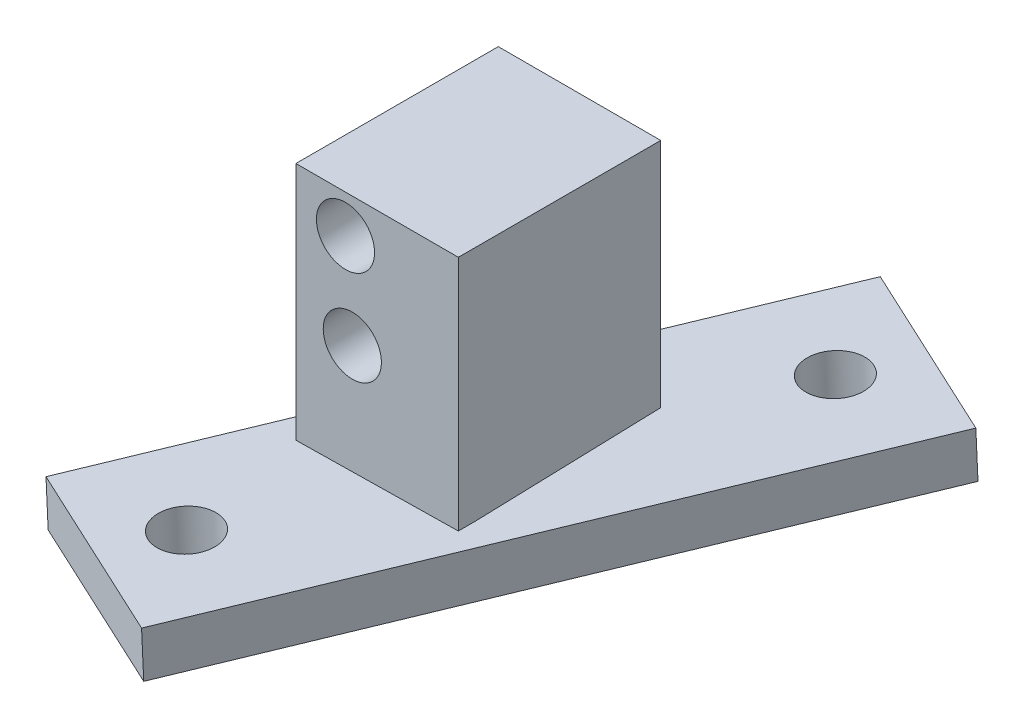
ISO-10303-21;
HEADER;
FILE_DESCRIPTION(('STEP AP214'),'2;1');
FILE_NAME('part.step','',(''),(''),'','','');
FILE_SCHEMA(('AUTOMOTIVE_DESIGN { 1 0 10303 214 1 1 1 1 }'));
ENDSEC;
DATA;
#1=APPLICATION_CONTEXT('core data for automotive mechanical design processes');
#2=APPLICATION_PROTOCOL_DEFINITION('international standard','automotive_design',2000,#1);
#3=PRODUCT_CONTEXT('',#1,'mechanical');
#4=PRODUCT('Part','Part','',(#3));
#5=PRODUCT_RELATED_PRODUCT_CATEGORY('part','',(#4));
#6=PRODUCT_DEFINITION_FORMATION('','',#4);
#7=PRODUCT_DEFINITION_CONTEXT('part definition',#1,'design');
#8=PRODUCT_DEFINITION('design','',#6,#7);
#9=PRODUCT_DEFINITION_SHAPE('','',#8);
#10=(LENGTH_UNIT() NAMED_UNIT(*) SI_UNIT(.MILLI.,.METRE.));
#11=(NAMED_UNIT(*) PLANE_ANGLE_UNIT() SI_UNIT($,.RADIAN.));
#12=(NAMED_UNIT(*) SI_UNIT($,.STERADIAN.) SOLID_ANGLE_UNIT());
#13=UNCERTAINTY_MEASURE_WITH_UNIT(LENGTH_MEASURE(1.E-05),#10,'distance_accuracy_value','');
#14=(GEOMETRIC_REPRESENTATION_CONTEXT(3) GLOBAL_UNCERTAINTY_ASSIGNED_CONTEXT((#13)) GLOBAL_UNIT_ASSIGNED_CONTEXT((#10,
#11,#12)) REPRESENTATION_CONTEXT('',''));
#15=CARTESIAN_POINT('',(0.,0.,0.));
#16=DIRECTION('',(0.,0.,1.));
#17=DIRECTION('',(1.,0.,0.));
#18=AXIS2_PLACEMENT_3D('',#15,#16,#17);
#19=CARTESIAN_POINT('',(-174.049593375286,0.,53.2479277886373));
#20=DIRECTION('',(1.,0.,0.));
#21=DIRECTION('',(0.,0.,-1.));
#22=AXIS2_PLACEMENT_3D('',#19,#20,#21);
#23=PLANE('',#22);
#24=DIRECTION('',(0.,1.,0.));
#25=VECTOR('',#24,1.);
#26=CARTESIAN_POINT('',(-174.049593375286,0.,22.0980000000002));
#27=LINE('',#26,#25);
#28=CARTESIAN_POINT('',(-174.049593375286,211.933065834821,22.0980000000002));
#29=VERTEX_POINT('',#28);
#30=CARTESIAN_POINT('',(-174.049593375286,237.82004779774,22.0980000000002));
#31=VERTEX_POINT('',#30);
#32=EDGE_CURVE('E140',#29,#31,#27,.T.);
#33=ORIENTED_EDGE('',*,*,#32,.F.);
#34=DIRECTION('',(0.,0.,1.));
#35=VECTOR('',#34,1.);
#36=CARTESIAN_POINT('',(-174.049593375286,211.933065834821,-17.7469464326559));
#37=LINE('',#36,#35);
#38=CARTESIAN_POINT('',(-174.049593375286,211.933065834821,20.2800597181621));
#39=VERTEX_POINT('',#38);
#40=EDGE_CURVE('E154',#39,#29,#37,.T.);
#41=ORIENTED_EDGE('',*,*,#40,.F.);
#42=DIRECTION('',(0.,0.03039944749549,-0.999537829995428));
#43=VECTOR('',#42,1.);
#44=CARTESIAN_POINT('',(-174.049593375286,210.735471106579,59.6571318198355));
#45=LINE('',#44,#43);
#46=CARTESIAN_POINT('',(-174.049593375286,212.54985350619,0.));
#47=VERTEX_POINT('',#46);
#48=EDGE_CURVE('E222',#39,#47,#45,.T.);
#49=ORIENTED_EDGE('',*,*,#48,.T.);
#50=DIRECTION('',(0.,-1.,0.));
#51=VECTOR('',#50,1.);
#52=CARTESIAN_POINT('',(-174.049593375286,0.,0.));
#53=LINE('',#52,#51);
#54=CARTESIAN_POINT('',(-174.049593375286,237.82004779774,0.));
#55=VERTEX_POINT('',#54);
#56=EDGE_CURVE('E239',#55,#47,#53,.T.);
#57=ORIENTED_EDGE('',*,*,#56,.F.);
#58=DIRECTION('',(0.,0.,-1.));
#59=VECTOR('',#58,1.);
#60=CARTESIAN_POINT('',(-174.049593375286,237.82004779774,53.2479277886373));
#61=LINE('',#60,#59);
#62=EDGE_CURVE('E255',#31,#55,#61,.T.);
#63=ORIENTED_EDGE('',*,*,#62,.F.);
#64=EDGE_LOOP('',(#33,#41,#49,#57,#63));
#65=FACE_BOUND('',#64,.T.);
#66=ADVANCED_FACE('F47',(#65),#23,.T.);
#67=CARTESIAN_POINT('',(-191.787654937191,0.,53.2479277886373));
#68=DIRECTION('',(-1.,0.,0.));
#69=DIRECTION('',(0.,0.,1.));
#70=AXIS2_PLACEMENT_3D('',#67,#68,#69);
#71=PLANE('',#70);
#72=DIRECTION('',(0.,-1.,0.));
#73=VECTOR('',#72,1.);
#74=CARTESIAN_POINT('',(-191.787654937191,0.,22.0980000000002));
#75=LINE('',#74,#73);
#76=CARTESIAN_POINT('',(-191.787654937191,237.82004779774,22.0980000000002));
#77=VERTEX_POINT('',#76);
#78=CARTESIAN_POINT('',(-191.787654937191,211.652316965885,22.0980000000002));
#79=VERTEX_POINT('',#78);
#80=EDGE_CURVE('E132',#77,#79,#75,.T.);
#81=ORIENTED_EDGE('',*,*,#80,.F.);
#82=DIRECTION('',(0.,0.,-1.));
#83=VECTOR('',#82,1.);
#84=CARTESIAN_POINT('',(-191.787654937191,237.82004779774,53.2479277886373));
#85=LINE('',#84,#83);
#86=CARTESIAN_POINT('',(-191.787654937191,237.82004779774,0.));
#87=VERTEX_POINT('',#86);
#88=EDGE_CURVE('E234',#77,#87,#85,.T.);
#89=ORIENTED_EDGE('',*,*,#88,.T.);
#90=DIRECTION('',(0.,1.,0.));
#91=VECTOR('',#90,1.);
#92=CARTESIAN_POINT('',(-191.787654937191,0.,0.));
#93=LINE('',#92,#91);
#94=CARTESIAN_POINT('',(-191.787654937191,211.652316965885,0.));
#95=VERTEX_POINT('',#94);
#96=EDGE_CURVE('E240',#95,#87,#93,.T.);
#97=ORIENTED_EDGE('',*,*,#96,.F.);
#98=DIRECTION('',(0.,0.,1.));
#99=VECTOR('',#98,1.);
#100=CARTESIAN_POINT('',(-191.787654937191,211.652316965885,-17.7469464326559));
#101=LINE('',#100,#99);
#102=CARTESIAN_POINT('',(-191.787654937191,211.652316965885,15.0624183971901));
#103=VERTEX_POINT('',#102);
#104=EDGE_CURVE('E149',#95,#103,#101,.T.);
#105=ORIENTED_EDGE('',*,*,#104,.T.);
#106=DIRECTION('',(0.,0.999994210647786,-0.00340274461436711));
#107=VECTOR('',#106,1.);
#108=CARTESIAN_POINT('',(-191.787654937191,205.771765025982,15.0824285294788));
#109=LINE('',#108,#107);
#110=CARTESIAN_POINT('',(-191.787654937191,211.811868321559,15.0618754815307));
#111=VERTEX_POINT('',#110);
#112=EDGE_CURVE('E63',#103,#111,#109,.T.);
#113=ORIENTED_EDGE('',*,*,#112,.T.);
#114=DIRECTION('',(0.,0.03039944749549,-0.999537829995428));
#115=VECTOR('',#114,1.);
#116=CARTESIAN_POINT('',(-191.787654937191,212.073788458369,6.44990695093485));
#117=LINE('',#116,#115);
#118=CARTESIAN_POINT('',(-191.787654937191,211.652316965885,20.3079450308957));
#119=VERTEX_POINT('',#118);
#120=EDGE_CURVE('E56',#119,#111,#117,.T.);
#121=ORIENTED_EDGE('',*,*,#120,.F.);
#122=EDGE_CURVE('E144',#119,#79,#101,.T.);
#123=ORIENTED_EDGE('',*,*,#122,.T.);
#124=EDGE_LOOP('',(#81,#89,#97,#105,#113,#121,#123));
#125=FACE_BOUND('',#124,.T.);
#126=ADVANCED_FACE('F145',(#125),#71,.T.);
#127=CARTESIAN_POINT('',(-185.628460018152,223.67720196977,53.2479277886373));
#128=DIRECTION('',(0.,0.,-1.));
#129=DIRECTION('',(-1.,0.,0.));
#130=AXIS2_PLACEMENT_3D('',#127,#128,#129);
#131=CYLINDRICAL_SURFACE('',#130,3.17499999999997);
#132=CARTESIAN_POINT('',(-185.628460018152,223.67720196977,22.0980000000002));
#133=DIRECTION('',(0.,0.,-1.));
#134=DIRECTION('',(-1.,0.,0.));
#135=AXIS2_PLACEMENT_3D('',#132,#133,#134);
#136=CIRCLE('',#135,3.17499999999997);
#137=CARTESIAN_POINT('',(-188.803460018152,223.67720196977,22.0980000000002));
#138=VERTEX_POINT('',#137);
#139=EDGE_CURVE('E243',#138,#138,#136,.T.);
#140=ORIENTED_EDGE('',*,*,#139,.F.);
#141=EDGE_LOOP('',(#140));
#142=FACE_BOUND('',#141,.T.);
#143=CARTESIAN_POINT('',(-185.628460018152,223.67720196977,0.));
#144=DIRECTION('',(0.,0.,1.));
#145=DIRECTION('',(1.,0.,0.));
#146=AXIS2_PLACEMENT_3D('',#143,#144,#145);
#147=CIRCLE('',#146,3.17499999999997);
#148=CARTESIAN_POINT('',(-182.453460018152,223.67720196977,0.));
#149=VERTEX_POINT('',#148);
#150=EDGE_CURVE('E247',#149,#149,#147,.T.);
#151=ORIENTED_EDGE('',*,*,#150,.F.);
#152=EDGE_LOOP('',(#151));
#153=FACE_BOUND('',#152,.T.);
#154=ADVANCED_FACE('F328',(#142,#153),#131,.F.);
#155=CARTESIAN_POINT('',(-186.372442080017,233.67720196977,53.2479277886373));
#156=DIRECTION('',(0.,0.,-1.));
#157=DIRECTION('',(-1.,0.,0.));
#158=AXIS2_PLACEMENT_3D('',#155,#156,#157);
#159=CYLINDRICAL_SURFACE('',#158,3.17500000000009);
#160=CARTESIAN_POINT('',(-186.372442080017,233.67720196977,22.0980000000002));
#161=DIRECTION('',(0.,0.,-1.));
#162=DIRECTION('',(-1.,0.,0.));
#163=AXIS2_PLACEMENT_3D('',#160,#161,#162);
#164=CIRCLE('',#163,3.17500000000009);
#165=CARTESIAN_POINT('',(-189.547442080018,233.67720196977,22.0980000000002));
#166=VERTEX_POINT('',#165);
#167=EDGE_CURVE('E141',#166,#166,#164,.T.);
#168=ORIENTED_EDGE('',*,*,#167,.F.);
#169=EDGE_LOOP('',(#168));
#170=FACE_BOUND('',#169,.T.);
#171=CARTESIAN_POINT('',(-186.372442080017,233.67720196977,0.));
#172=DIRECTION('',(0.,0.,1.));
#173=DIRECTION('',(1.,0.,0.));
#174=AXIS2_PLACEMENT_3D('',#171,#172,#173);
#175=CIRCLE('',#174,3.17500000000009);
#176=CARTESIAN_POINT('',(-183.197442080017,233.67720196977,0.));
#177=VERTEX_POINT('',#176);
#178=EDGE_CURVE('E251',#177,#177,#175,.T.);
#179=ORIENTED_EDGE('',*,*,#178,.F.);
#180=EDGE_LOOP('',(#179));
#181=FACE_BOUND('',#180,.T.);
#182=ADVANCED_FACE('F332',(#170,#181),#159,.F.);
#183=CARTESIAN_POINT('',(0.,237.82004779774,53.2479277886373));
#184=DIRECTION('',(0.,1.,0.));
#185=DIRECTION('',(0.,0.,1.));
#186=AXIS2_PLACEMENT_3D('',#183,#184,#185);
#187=PLANE('',#186);
#188=DIRECTION('',(-1.,0.,0.));
#189=VECTOR('',#188,1.);
#190=CARTESIAN_POINT('',(0.,237.82004779774,22.0980000000002));
#191=LINE('',#190,#189);
#192=EDGE_CURVE('E137',#31,#77,#191,.T.);
#193=ORIENTED_EDGE('',*,*,#192,.F.);
#194=ORIENTED_EDGE('',*,*,#62,.T.);
#195=DIRECTION('',(1.,0.,0.));
#196=VECTOR('',#195,1.);
#197=CARTESIAN_POINT('',(0.,237.82004779774,0.));
#198=LINE('',#197,#196);
#199=EDGE_CURVE('E235',#87,#55,#198,.T.);
#200=ORIENTED_EDGE('',*,*,#199,.F.);
#201=ORIENTED_EDGE('',*,*,#88,.F.);
#202=EDGE_LOOP('',(#193,#194,#200,#201));
#203=FACE_BOUND('',#202,.T.);
#204=ADVANCED_FACE('F293',(#203),#187,.T.);
#205=CARTESIAN_POINT('',(0.,0.,0.));
#206=DIRECTION('',(0.,0.,1.));
#207=DIRECTION('',(1.,0.,0.));
#208=AXIS2_PLACEMENT_3D('',#205,#206,#207);
#209=PLANE('',#208);
#210=ORIENTED_EDGE('',*,*,#178,.T.);
#211=EDGE_LOOP('',(#210));
#212=FACE_BOUND('',#211,.T.);
#213=ORIENTED_EDGE('',*,*,#150,.T.);
#214=EDGE_LOOP('',(#213));
#215=FACE_BOUND('',#214,.T.);
#216=DIRECTION('',(0.999875524233858,0.0157777069965274,0.));
#217=VECTOR('',#216,1.);
#218=CARTESIAN_POINT('',(-3.39645909135796,215.24270385157,0.));
#219=LINE('',#218,#217);
#220=CARTESIAN_POINT('',(-184.760241635504,212.380842998485,0.));
#221=VERTEX_POINT('',#220);
#222=EDGE_CURVE('E71',#221,#47,#219,.T.);
#223=ORIENTED_EDGE('',*,*,#222,.F.);
#224=DIRECTION('',(0.00158782850533025,-0.999998739399524,0.));
#225=VECTOR('',#224,1.);
#226=CARTESIAN_POINT('',(-184.422551886707,-0.292831754055308,0.));
#227=LINE('',#226,#225);
#228=CARTESIAN_POINT('',(-184.759261492733,211.763558744085,0.));
#229=VERTEX_POINT('',#228);
#230=EDGE_CURVE('E272',#221,#229,#227,.T.);
#231=ORIENTED_EDGE('',*,*,#230,.T.);
#232=DIRECTION('',(-0.999874768918115,-0.0158255009698612,0.));
#233=VECTOR('',#232,1.);
#234=CARTESIAN_POINT('',(-191.787654937191,211.652316965885,0.));
#235=LINE('',#234,#233);
#236=EDGE_CURVE('E159',#229,#95,#235,.T.);
#237=ORIENTED_EDGE('',*,*,#236,.T.);
#238=ORIENTED_EDGE('',*,*,#96,.T.);
#239=ORIENTED_EDGE('',*,*,#199,.T.);
#240=ORIENTED_EDGE('',*,*,#56,.T.);
#241=EDGE_LOOP('',(#223,#231,#237,#238,#239,#240));
#242=FACE_BOUND('',#241,.T.);
#243=ADVANCED_FACE('F288',(#212,#215,#242),#209,.F.);
#244=CARTESIAN_POINT('',(-218.418058808739,235.670935246382,22.0980000000002));
#245=DIRECTION('',(0.,0.,-1.));
#246=DIRECTION('',(0.999875524233858,0.0157777069965279,0.));
#247=AXIS2_PLACEMENT_3D('',#244,#245,#246);
#248=PLANE('',#247);
#249=ORIENTED_EDGE('',*,*,#139,.T.);
#250=EDGE_LOOP('',(#249));
#251=FACE_BOUND('',#250,.T.);
#252=ORIENTED_EDGE('',*,*,#167,.T.);
#253=EDGE_LOOP('',(#252));
#254=FACE_BOUND('',#253,.T.);
#255=ORIENTED_EDGE('',*,*,#80,.T.);
#256=DIRECTION('',(0.999874768918114,0.0158255009698612,0.));
#257=VECTOR('',#256,1.);
#258=CARTESIAN_POINT('',(-191.787654937191,211.652316965885,22.0980000000002));
#259=LINE('',#258,#257);
#260=EDGE_CURVE('E135',#79,#29,#259,.T.);
#261=ORIENTED_EDGE('',*,*,#260,.T.);
#262=ORIENTED_EDGE('',*,*,#32,.T.);
#263=ORIENTED_EDGE('',*,*,#192,.T.);
#264=EDGE_LOOP('',(#255,#261,#262,#263));
#265=FACE_BOUND('',#264,.T.);
#266=ADVANCED_FACE('F49',(#251,#254,#265),#248,.F.);
#267=CARTESIAN_POINT('',(-183.061641055121,205.881868051363,47.4393640134294));
#268=DIRECTION('',(-0.42256570461406,-0.0342130418321604,0.905686310514084));
#269=DIRECTION('',(0.906216843823298,0.,0.42281323533085));
#270=AXIS2_PLACEMENT_3D('',#267,#268,#269);
#271=PLANE('',#270);
#272=DIRECTION('',(0.906195077914853,0.00143888418996083,0.422857435047772));
#273=VECTOR('',#272,1.);
#274=CARTESIAN_POINT('',(-183.141754772605,210.958888767075,47.5937740017752));
#275=LINE('',#274,#273);
#276=CARTESIAN_POINT('',(-202.706506504787,210.927823257414,38.4642819790938));
#277=VERTEX_POINT('',#276);
#278=CARTESIAN_POINT('',(-183.141754772605,210.958888767075,47.5937740017752));
#279=VERTEX_POINT('',#278);
#280=EDGE_CURVE('E181',#277,#279,#275,.T.);
#281=ORIENTED_EDGE('',*,*,#280,.F.);
#282=DIRECTION('',(-0.0157704168275925,0.999413526714982,0.0303956669972097));
#283=VECTOR('',#282,1.);
#284=CARTESIAN_POINT('',(-202.626392787303,205.850802541702,38.309871990748));
#285=LINE('',#284,#283);
#286=CARTESIAN_POINT('',(-202.626392787303,205.850802541702,38.309871990748));
#287=VERTEX_POINT('',#286);
#288=EDGE_CURVE('E218',#287,#277,#285,.T.);
#289=ORIENTED_EDGE('',*,*,#288,.F.);
#290=DIRECTION('',(0.906195077914853,0.00143888418996083,0.422857435047772));
#291=VECTOR('',#290,1.);
#292=CARTESIAN_POINT('',(-183.061641055121,205.881868051363,47.4393640134294));
#293=LINE('',#292,#291);
#294=CARTESIAN_POINT('',(-183.061641055121,205.881868051363,47.4393640134294));
#295=VERTEX_POINT('',#294);
#296=EDGE_CURVE('E185',#287,#295,#293,.T.);
#297=ORIENTED_EDGE('',*,*,#296,.T.);
#298=DIRECTION('',(-0.0157704168275925,0.999413526714982,0.0303956669972097));
#299=VECTOR('',#298,1.);
#300=CARTESIAN_POINT('',(-183.061641055121,205.881868051363,47.4393640134294));
#301=LINE('',#300,#299);
#302=EDGE_CURVE('E202',#295,#279,#301,.T.);
#303=ORIENTED_EDGE('',*,*,#302,.T.);
#304=EDGE_LOOP('',(#281,#289,#297,#303));
#305=FACE_BOUND('',#304,.T.);
#306=ADVANCED_FACE('F308',(#305),#271,.T.);
#307=CARTESIAN_POINT('',(-202.626392787303,205.850802541702,38.309871990748));
#308=DIRECTION('',(-0.906195077914854,-0.00143888418996126,-0.422857435047771));
#309=DIRECTION('',(-0.42285787278787,0.,0.906196016003887));
#310=AXIS2_PLACEMENT_3D('',#307,#308,#309);
#311=PLANE('',#310);
#312=ORIENTED_EDGE('',*,*,#112,.F.);
#313=DIRECTION('',(-0.422839676470139,-0.00669248781756386,0.906179793754771));
#314=VECTOR('',#313,1.);
#315=CARTESIAN_POINT('',(-202.649665272423,211.480398681278,38.3405893756367));
#316=LINE('',#315,#314);
#317=EDGE_CURVE('E165',#229,#103,#316,.T.);
#318=ORIENTED_EDGE('',*,*,#317,.F.);
#319=ORIENTED_EDGE('',*,*,#230,.F.);
#320=DIRECTION('',(-0.422565704614059,-0.0342130418321602,0.905686310514084));
#321=VECTOR('',#320,1.);
#322=CARTESIAN_POINT('',(-202.706506504787,210.927823257414,38.4642819790938));
#323=LINE('',#322,#321);
#324=CARTESIAN_POINT('',(-173.726950482355,213.274153666263,-23.6476851959621));
#325=VERTEX_POINT('',#324);
#326=EDGE_CURVE('E190',#325,#221,#323,.T.);
#327=ORIENTED_EDGE('',*,*,#326,.F.);
#328=DIRECTION('',(-0.0157704168275925,0.999413526714982,0.0303956669972097));
#329=VECTOR('',#328,1.);
#330=CARTESIAN_POINT('',(-173.646836764871,208.197132950551,-23.8020951843079));
#331=LINE('',#330,#329);
#332=CARTESIAN_POINT('',(-173.646836764871,208.197132950551,-23.8020951843079));
#333=VERTEX_POINT('',#332);
#334=EDGE_CURVE('E223',#333,#325,#331,.T.);
#335=ORIENTED_EDGE('',*,*,#334,.F.);
#336=DIRECTION('',(-0.422565704614059,-0.0342130418321602,0.905686310514084));
#337=VECTOR('',#336,1.);
#338=CARTESIAN_POINT('',(-202.626392787303,205.850802541702,38.309871990748));
#339=LINE('',#338,#337);
#340=EDGE_CURVE('E198',#333,#287,#339,.T.);
#341=ORIENTED_EDGE('',*,*,#340,.T.);
#342=ORIENTED_EDGE('',*,*,#288,.T.);
#343=EDGE_CURVE('E214',#111,#277,#323,.T.);
#344=ORIENTED_EDGE('',*,*,#343,.F.);
#345=EDGE_LOOP('',(#312,#318,#319,#327,#335,#341,#342,#344));
#346=FACE_BOUND('',#345,.T.);
#347=ADVANCED_FACE('F280',(#346),#311,.T.);
#348=CARTESIAN_POINT('',(-173.646836764871,208.197132950551,-23.8020951843079));
#349=DIRECTION('',(0.422565704614059,0.0342130418321604,-0.905686310514084));
#350=DIRECTION('',(-0.906216843823298,0.,-0.42281323533085));
#351=AXIS2_PLACEMENT_3D('',#348,#349,#350);
#352=PLANE('',#351);
#353=DIRECTION('',(-0.906195077914854,-0.00143888418996212,-0.422857435047771));
#354=VECTOR('',#353,1.);
#355=CARTESIAN_POINT('',(-173.726950482355,213.274153666263,-23.6476851959621));
#356=LINE('',#355,#354);
#357=CARTESIAN_POINT('',(-154.162198750173,213.305219175925,-14.5181931732807));
#358=VERTEX_POINT('',#357);
#359=EDGE_CURVE('E210',#358,#325,#356,.T.);
#360=ORIENTED_EDGE('',*,*,#359,.F.);
#361=DIRECTION('',(-0.0157704168275925,0.999413526714982,0.0303956669972097));
#362=VECTOR('',#361,1.);
#363=CARTESIAN_POINT('',(-154.082085032689,208.228198460212,-14.6726031616265));
#364=LINE('',#363,#362);
#365=CARTESIAN_POINT('',(-154.082085032689,208.228198460212,-14.6726031616265));
#366=VERTEX_POINT('',#365);
#367=EDGE_CURVE('E226',#366,#358,#364,.T.);
#368=ORIENTED_EDGE('',*,*,#367,.F.);
#369=DIRECTION('',(-0.906195077914854,-0.00143888418996212,-0.422857435047771));
#370=VECTOR('',#369,1.);
#371=CARTESIAN_POINT('',(-173.646836764871,208.197132950551,-23.8020951843079));
#372=LINE('',#371,#370);
#373=EDGE_CURVE('E194',#366,#333,#372,.T.);
#374=ORIENTED_EDGE('',*,*,#373,.T.);
#375=ORIENTED_EDGE('',*,*,#334,.T.);
#376=EDGE_LOOP('',(#360,#368,#374,#375));
#377=FACE_BOUND('',#376,.T.);
#378=ADVANCED_FACE('F302',(#377),#352,.T.);
#379=CARTESIAN_POINT('',(-154.082085032689,208.228198460212,-14.6726031616265));
#380=DIRECTION('',(0.906195077914854,0.00143888418996127,0.422857435047771));
#381=DIRECTION('',(0.42285787278787,0.,-0.906196016003887));
#382=AXIS2_PLACEMENT_3D('',#379,#380,#381);
#383=PLANE('',#382);
#384=DIRECTION('',(0.422565704614059,0.0342130418321606,-0.905686310514084));
#385=VECTOR('',#384,1.);
#386=CARTESIAN_POINT('',(-154.162198750173,213.305219175925,-14.5181931732807));
#387=LINE('',#386,#385);
#388=EDGE_CURVE('E206',#279,#358,#387,.T.);
#389=ORIENTED_EDGE('',*,*,#388,.F.);
#390=ORIENTED_EDGE('',*,*,#302,.F.);
#391=DIRECTION('',(0.422565704614059,0.0342130418321606,-0.905686310514084));
#392=VECTOR('',#391,1.);
#393=CARTESIAN_POINT('',(-154.082085032689,208.228198460212,-14.6726031616265));
#394=LINE('',#393,#392);
#395=EDGE_CURVE('E189',#295,#366,#394,.T.);
#396=ORIENTED_EDGE('',*,*,#395,.T.);
#397=ORIENTED_EDGE('',*,*,#367,.T.);
#398=EDGE_LOOP('',(#389,#390,#396,#397));
#399=FACE_BOUND('',#398,.T.);
#400=ADVANCED_FACE('F311',(#399),#383,.T.);
#401=CARTESIAN_POINT('',(-3.31320739696165,209.966821139578,6.38582669257924));
#402=DIRECTION('',(0.0157704168275921,-0.999413526714982,-0.0303956669972097));
#403=DIRECTION('',(0.,0.03039944749549,-0.999537829995428));
#404=AXIS2_PLACEMENT_3D('',#401,#402,#403);
#405=PLANE('',#404);
#406=CARTESIAN_POINT('',(-167.084411567939,207.951962326621,-12.3360194868499));
#407=DIRECTION('',(-0.0157704168275925,0.999413526714983,0.0303956669972098));
#408=DIRECTION('',(0.,-0.0303994474954901,0.999537829995428));
#409=AXIS2_PLACEMENT_3D('',#406,#407,#408);
#410=CIRCLE('',#409,3.17499999999999);
#411=CARTESIAN_POINT('',(-167.084411567939,207.855444080823,-9.16248687661439));
#412=VERTEX_POINT('',#411);
#413=EDGE_CURVE('E169',#412,#412,#410,.T.);
#414=ORIENTED_EDGE('',*,*,#413,.T.);
#415=EDGE_LOOP('',(#414));
#416=FACE_BOUND('',#415,.T.);
#417=CARTESIAN_POINT('',(-189.624066252053,206.127038675293,35.9732883159714));
#418=DIRECTION('',(-0.0157704168275925,0.999413526714983,0.0303956669972098));
#419=DIRECTION('',(0.,-0.0303994474954901,0.999537829995428));
#420=AXIS2_PLACEMENT_3D('',#417,#418,#419);
#421=CIRCLE('',#420,3.17499999999999);
#422=CARTESIAN_POINT('',(-189.624066252053,206.030520429495,39.1468209262068));
#423=VERTEX_POINT('',#422);
#424=EDGE_CURVE('E177',#423,#423,#421,.T.);
#425=ORIENTED_EDGE('',*,*,#424,.T.);
#426=EDGE_LOOP('',(#425));
#427=FACE_BOUND('',#426,.T.);
#428=ORIENTED_EDGE('',*,*,#296,.F.);
#429=ORIENTED_EDGE('',*,*,#340,.F.);
#430=ORIENTED_EDGE('',*,*,#373,.F.);
#431=ORIENTED_EDGE('',*,*,#395,.F.);
#432=EDGE_LOOP('',(#428,#429,#430,#431));
#433=FACE_BOUND('',#432,.T.);
#434=ADVANCED_FACE('F306',(#416,#427,#433),#405,.T.);
#435=CARTESIAN_POINT('',(-3.39332111444582,215.04384185529,6.54023668092507));
#436=DIRECTION('',(0.0157704168275921,-0.999413526714982,-0.0303956669972097));
#437=DIRECTION('',(0.,0.03039944749549,-0.999537829995428));
#438=AXIS2_PLACEMENT_3D('',#435,#436,#437);
#439=PLANE('',#438);
#440=ORIENTED_EDGE('',*,*,#48,.F.);
#441=DIRECTION('',(-0.999873533696874,-0.0158254814194179,0.0015718620706744));
#442=VECTOR('',#441,1.);
#443=CARTESIAN_POINT('',(-3.36566524311303,214.634562816406,20.0117341913201));
#444=LINE('',#443,#442);
#445=EDGE_CURVE('E11',#39,#119,#444,.T.);
#446=ORIENTED_EDGE('',*,*,#445,.T.);
#447=ORIENTED_EDGE('',*,*,#120,.T.);
#448=ORIENTED_EDGE('',*,*,#343,.T.);
#449=ORIENTED_EDGE('',*,*,#280,.T.);
#450=ORIENTED_EDGE('',*,*,#388,.T.);
#451=ORIENTED_EDGE('',*,*,#359,.T.);
#452=ORIENTED_EDGE('',*,*,#326,.T.);
#453=ORIENTED_EDGE('',*,*,#222,.T.);
#454=EDGE_LOOP('',(#440,#446,#447,#448,#449,#450,#451,#452,#453));
#455=FACE_BOUND('',#454,.T.);
#456=CARTESIAN_POINT('',(-167.164525285423,213.028983042333,-12.181609498504));
#457=DIRECTION('',(-0.0157704168275925,0.999413526714983,0.0303956669972098));
#458=DIRECTION('',(0.,-0.0303994474954901,0.999537829995428));
#459=AXIS2_PLACEMENT_3D('',#456,#457,#458);
#460=CIRCLE('',#459,3.17499999999999);
#461=CARTESIAN_POINT('',(-167.164525285423,212.932464796535,-9.00807688826857));
#462=VERTEX_POINT('',#461);
#463=EDGE_CURVE('E168',#462,#462,#460,.T.);
#464=ORIENTED_EDGE('',*,*,#463,.F.);
#465=EDGE_LOOP('',(#464));
#466=FACE_BOUND('',#465,.T.);
#467=CARTESIAN_POINT('',(-189.704179969537,211.204059391005,36.1276983043172));
#468=DIRECTION('',(-0.0157704168275925,0.999413526714983,0.0303956669972098));
#469=DIRECTION('',(0.,-0.0303994474954901,0.999537829995428));
#470=AXIS2_PLACEMENT_3D('',#467,#468,#469);
#471=CIRCLE('',#470,3.17499999999999);
#472=CARTESIAN_POINT('',(-189.704179969537,211.107541145207,39.3012309145527));
#473=VERTEX_POINT('',#472);
#474=EDGE_CURVE('E173',#473,#473,#471,.T.);
#475=ORIENTED_EDGE('',*,*,#474,.F.);
#476=EDGE_LOOP('',(#475));
#477=FACE_BOUND('',#476,.T.);
#478=ADVANCED_FACE('F277',(#455,#466,#477),#439,.F.);
#479=CARTESIAN_POINT('',(-189.624066252053,206.127038675293,35.9732883159714));
#480=DIRECTION('',(-0.0157704168275925,0.999413526714982,0.0303956669972097));
#481=DIRECTION('',(0.,-0.0303994474954901,0.999537829995428));
#482=AXIS2_PLACEMENT_3D('',#479,#480,#481);
#483=CYLINDRICAL_SURFACE('',#482,3.17499999999999);
#484=ORIENTED_EDGE('',*,*,#424,.F.);
#485=EDGE_LOOP('',(#484));
#486=FACE_BOUND('',#485,.T.);
#487=ORIENTED_EDGE('',*,*,#474,.T.);
#488=EDGE_LOOP('',(#487));
#489=FACE_BOUND('',#488,.T.);
#490=ADVANCED_FACE('F374',(#486,#489),#483,.F.);
#491=CARTESIAN_POINT('',(-167.084411567939,207.951962326621,-12.3360194868499));
#492=DIRECTION('',(-0.0157704168275925,0.999413526714982,0.0303956669972097));
#493=DIRECTION('',(0.,-0.0303994474954901,0.999537829995428));
#494=AXIS2_PLACEMENT_3D('',#491,#492,#493);
#495=CYLINDRICAL_SURFACE('',#494,3.17499999999999);
#496=ORIENTED_EDGE('',*,*,#413,.F.);
#497=EDGE_LOOP('',(#496));
#498=FACE_BOUND('',#497,.T.);
#499=ORIENTED_EDGE('',*,*,#463,.T.);
#500=EDGE_LOOP('',(#499));
#501=FACE_BOUND('',#500,.T.);
#502=ADVANCED_FACE('F383',(#498,#501),#495,.F.);
#503=CARTESIAN_POINT('',(-191.787654937191,211.652316965885,-17.7469464326559));
#504=DIRECTION('',(0.0158255009698612,-0.999874768918115,0.));
#505=DIRECTION('',(0.999874768918115,0.0158255009698612,0.));
#506=AXIS2_PLACEMENT_3D('',#503,#504,#505);
#507=PLANE('',#506);
#508=ORIENTED_EDGE('',*,*,#445,.F.);
#509=ORIENTED_EDGE('',*,*,#40,.T.);
#510=ORIENTED_EDGE('',*,*,#260,.F.);
#511=ORIENTED_EDGE('',*,*,#122,.F.);
#512=EDGE_LOOP('',(#508,#509,#510,#511));
#513=FACE_BOUND('',#512,.T.);
#514=ADVANCED_FACE('F152',(#513),#507,.T.);
#515=ORIENTED_EDGE('',*,*,#236,.F.);
#516=ORIENTED_EDGE('',*,*,#317,.T.);
#517=ORIENTED_EDGE('',*,*,#104,.F.);
#518=EDGE_LOOP('',(#515,#516,#517));
#519=FACE_BOUND('',#518,.T.);
#520=ADVANCED_FACE('F291',(#519),#507,.T.);
#521=CLOSED_SHELL('',(#66,#126,#154,#182,#204,#243,#266,#306,#347,#378,#400,#434,#478,#490,#502,
#514,#520));
#522=MANIFOLD_SOLID_BREP('B2',#521);
#523=ADVANCED_BREP_SHAPE_REPRESENTATION('',(#18,#522),#14);
#524=SHAPE_DEFINITION_REPRESENTATION(#9,#523);
ENDSEC;
END-ISO-10303-21;
